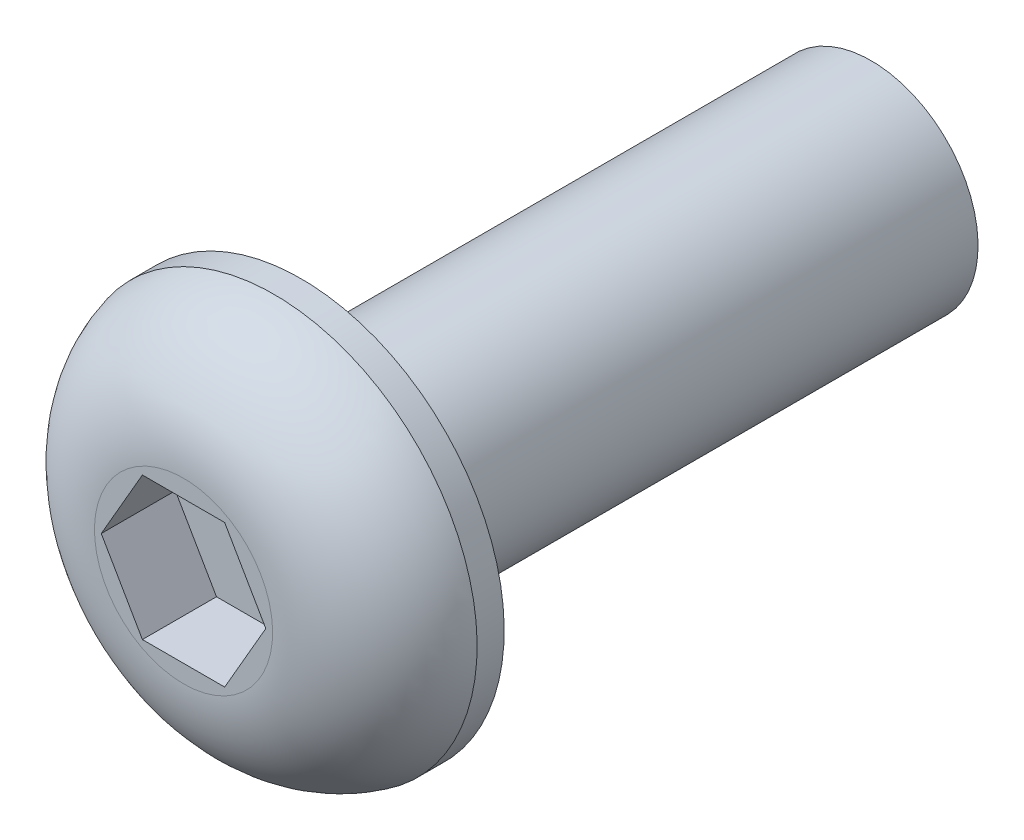
ISO-10303-21;
HEADER;
FILE_DESCRIPTION(('STEP AP214'),'2;1');
FILE_NAME('part.step','',(''),(''),'','','');
FILE_SCHEMA(('AUTOMOTIVE_DESIGN { 1 0 10303 214 1 1 1 1 }'));
ENDSEC;
DATA;
#1=APPLICATION_CONTEXT('core data for automotive mechanical design processes');
#2=APPLICATION_PROTOCOL_DEFINITION('international standard','automotive_design',2000,#1);
#3=PRODUCT_CONTEXT('',#1,'mechanical');
#4=PRODUCT('Part','Part','',(#3));
#5=PRODUCT_RELATED_PRODUCT_CATEGORY('part','',(#4));
#6=PRODUCT_DEFINITION_FORMATION('','',#4);
#7=PRODUCT_DEFINITION_CONTEXT('part definition',#1,'design');
#8=PRODUCT_DEFINITION('design','',#6,#7);
#9=PRODUCT_DEFINITION_SHAPE('','',#8);
#10=(LENGTH_UNIT() NAMED_UNIT(*) SI_UNIT(.MILLI.,.METRE.));
#11=(NAMED_UNIT(*) PLANE_ANGLE_UNIT() SI_UNIT($,.RADIAN.));
#12=(NAMED_UNIT(*) SI_UNIT($,.STERADIAN.) SOLID_ANGLE_UNIT());
#13=UNCERTAINTY_MEASURE_WITH_UNIT(LENGTH_MEASURE(1.E-05),#10,'distance_accuracy_value','');
#14=(GEOMETRIC_REPRESENTATION_CONTEXT(3) GLOBAL_UNCERTAINTY_ASSIGNED_CONTEXT((#13)) GLOBAL_UNIT_ASSIGNED_CONTEXT((#10,
#11,#12)) REPRESENTATION_CONTEXT('',''));
#15=CARTESIAN_POINT('',(0.,0.,0.));
#16=DIRECTION('',(0.,0.,1.));
#17=DIRECTION('',(1.,0.,0.));
#18=AXIS2_PLACEMENT_3D('',#15,#16,#17);
#19=CARTESIAN_POINT('',(0.,1.5,-8.));
#20=DIRECTION('',(0.,0.,1.));
#21=DIRECTION('',(0.,-1.,0.));
#22=AXIS2_PLACEMENT_3D('',#19,#20,#21);
#23=PLANE('',#22);
#24=CARTESIAN_POINT('',(0.,0.,-8.));
#25=DIRECTION('',(0.,0.,1.));
#26=DIRECTION('',(0.,-1.,0.));
#27=AXIS2_PLACEMENT_3D('',#24,#25,#26);
#28=CIRCLE('',#27,1.5);
#29=CARTESIAN_POINT('',(0.,-1.5,-8.));
#30=VERTEX_POINT('',#29);
#31=EDGE_CURVE('E11',#30,#30,#28,.T.);
#32=ORIENTED_EDGE('',*,*,#31,.F.);
#33=EDGE_LOOP('',(#32));
#34=FACE_BOUND('',#33,.T.);
#35=ADVANCED_FACE('F34',(#34),#23,.F.);
#36=CARTESIAN_POINT('',(0.,0.,5.58488227818494));
#37=DIRECTION('',(0.,0.,1.));
#38=DIRECTION('',(0.,-1.,0.));
#39=AXIS2_PLACEMENT_3D('',#36,#37,#38);
#40=CYLINDRICAL_SURFACE('',#39,1.5);
#41=CARTESIAN_POINT('',(0.,0.,0.));
#42=DIRECTION('',(0.,0.,1.));
#43=DIRECTION('',(0.,-1.,0.));
#44=AXIS2_PLACEMENT_3D('',#41,#42,#43);
#45=CIRCLE('',#44,1.5);
#46=CARTESIAN_POINT('',(0.,-1.5,0.));
#47=VERTEX_POINT('',#46);
#48=EDGE_CURVE('E41',#47,#47,#45,.T.);
#49=ORIENTED_EDGE('',*,*,#48,.F.);
#50=EDGE_LOOP('',(#49));
#51=FACE_BOUND('',#50,.T.);
#52=ORIENTED_EDGE('',*,*,#31,.T.);
#53=EDGE_LOOP('',(#52));
#54=FACE_BOUND('',#53,.T.);
#55=ADVANCED_FACE('F153',(#51,#54),#40,.T.);
#56=CARTESIAN_POINT('',(0.,2.85,0.));
#57=DIRECTION('',(0.,0.,1.));
#58=DIRECTION('',(0.,-1.,0.));
#59=AXIS2_PLACEMENT_3D('',#56,#57,#58);
#60=PLANE('',#59);
#61=CARTESIAN_POINT('',(0.,0.,0.));
#62=DIRECTION('',(0.,0.,1.));
#63=DIRECTION('',(0.,-1.,0.));
#64=AXIS2_PLACEMENT_3D('',#61,#62,#63);
#65=CIRCLE('',#64,2.85);
#66=CARTESIAN_POINT('',(0.,-2.85,0.));
#67=VERTEX_POINT('',#66);
#68=EDGE_CURVE('E146',#67,#67,#65,.T.);
#69=ORIENTED_EDGE('',*,*,#68,.F.);
#70=EDGE_LOOP('',(#69));
#71=FACE_BOUND('',#70,.T.);
#72=ORIENTED_EDGE('',*,*,#48,.T.);
#73=EDGE_LOOP('',(#72));
#74=FACE_BOUND('',#73,.T.);
#75=ADVANCED_FACE('F151',(#71,#74),#60,.F.);
#76=CARTESIAN_POINT('',(0.,0.,5.58488227818494));
#77=DIRECTION('',(0.,0.,1.));
#78=DIRECTION('',(0.,-1.,0.));
#79=AXIS2_PLACEMENT_3D('',#76,#77,#78);
#80=CYLINDRICAL_SURFACE('',#79,2.85);
#81=CARTESIAN_POINT('',(0.,0.,0.38));
#82=DIRECTION('',(0.,0.,1.));
#83=DIRECTION('',(0.,-1.,0.));
#84=AXIS2_PLACEMENT_3D('',#81,#82,#83);
#85=CIRCLE('',#84,2.85);
#86=CARTESIAN_POINT('',(0.,-2.85,0.38));
#87=VERTEX_POINT('',#86);
#88=EDGE_CURVE('E143',#87,#87,#85,.T.);
#89=ORIENTED_EDGE('',*,*,#88,.F.);
#90=EDGE_LOOP('',(#89));
#91=FACE_BOUND('',#90,.T.);
#92=ORIENTED_EDGE('',*,*,#68,.T.);
#93=EDGE_LOOP('',(#92));
#94=FACE_BOUND('',#93,.T.);
#95=ADVANCED_FACE('F171',(#91,#94),#80,.T.);
#96=CARTESIAN_POINT('',(0.,0.,0.00712598425196939));
#97=DIRECTION('',(0.,0.,1.));
#98=DIRECTION('',(0.,-1.,0.));
#99=AXIS2_PLACEMENT_3D('',#96,#97,#98);
#100=DEGENERATE_TOROIDAL_SURFACE('',#99,1.25,1.64287401574803,.T.);
#101=CARTESIAN_POINT('',(0.,0.,1.65));
#102=DIRECTION('',(0.,0.,1.));
#103=DIRECTION('',(0.,-1.,0.));
#104=AXIS2_PLACEMENT_3D('',#101,#102,#103);
#105=CIRCLE('',#104,1.25);
#106=CARTESIAN_POINT('',(0.,-1.25,1.65));
#107=VERTEX_POINT('',#106);
#108=EDGE_CURVE('E135',#107,#107,#105,.T.);
#109=ORIENTED_EDGE('',*,*,#108,.F.);
#110=EDGE_LOOP('',(#109));
#111=FACE_BOUND('',#110,.T.);
#112=ORIENTED_EDGE('',*,*,#88,.T.);
#113=EDGE_LOOP('',(#112));
#114=FACE_BOUND('',#113,.T.);
#115=ADVANCED_FACE('F179',(#111,#114),#100,.T.);
#116=CARTESIAN_POINT('',(0.,0.,1.65));
#117=DIRECTION('',(0.,0.,-1.));
#118=DIRECTION('',(0.,1.,0.));
#119=AXIS2_PLACEMENT_3D('',#116,#117,#118);
#120=PLANE('',#119);
#121=DIRECTION('',(0.5,0.866025403784439,0.));
#122=VECTOR('',#121,1.);
#123=CARTESIAN_POINT('',(0.577350269189626,-1.,1.65));
#124=LINE('',#123,#122);
#125=CARTESIAN_POINT('',(0.577350269189626,-1.,1.65));
#126=VERTEX_POINT('',#125);
#127=CARTESIAN_POINT('',(1.15470053837925,0.,1.65));
#128=VERTEX_POINT('',#127);
#129=EDGE_CURVE('E122',#126,#128,#124,.T.);
#130=ORIENTED_EDGE('',*,*,#129,.F.);
#131=DIRECTION('',(1.,0.,0.));
#132=VECTOR('',#131,1.);
#133=CARTESIAN_POINT('',(-0.577350269189626,-1.,1.65));
#134=LINE('',#133,#132);
#135=CARTESIAN_POINT('',(-0.577350269189626,-1.,1.65));
#136=VERTEX_POINT('',#135);
#137=EDGE_CURVE('E48',#136,#126,#134,.T.);
#138=ORIENTED_EDGE('',*,*,#137,.F.);
#139=DIRECTION('',(0.5,-0.866025403784439,0.));
#140=VECTOR('',#139,1.);
#141=CARTESIAN_POINT('',(-1.15470053837925,0.,1.65));
#142=LINE('',#141,#140);
#143=CARTESIAN_POINT('',(-1.15470053837925,0.,1.65));
#144=VERTEX_POINT('',#143);
#145=EDGE_CURVE('E131',#144,#136,#142,.T.);
#146=ORIENTED_EDGE('',*,*,#145,.F.);
#147=DIRECTION('',(-0.5,-0.866025403784439,0.));
#148=VECTOR('',#147,1.);
#149=CARTESIAN_POINT('',(-0.577350269189626,1.,1.65));
#150=LINE('',#149,#148);
#151=CARTESIAN_POINT('',(-0.577350269189626,1.,1.65));
#152=VERTEX_POINT('',#151);
#153=EDGE_CURVE('E129',#152,#144,#150,.T.);
#154=ORIENTED_EDGE('',*,*,#153,.F.);
#155=DIRECTION('',(-1.,0.,0.));
#156=VECTOR('',#155,1.);
#157=CARTESIAN_POINT('',(0.577350269189626,1.,1.65));
#158=LINE('',#157,#156);
#159=CARTESIAN_POINT('',(0.577350269189626,1.,1.65));
#160=VERTEX_POINT('',#159);
#161=EDGE_CURVE('E96',#160,#152,#158,.T.);
#162=ORIENTED_EDGE('',*,*,#161,.F.);
#163=DIRECTION('',(-0.5,0.866025403784439,0.));
#164=VECTOR('',#163,1.);
#165=CARTESIAN_POINT('',(1.15470053837925,0.,1.65));
#166=LINE('',#165,#164);
#167=EDGE_CURVE('E125',#128,#160,#166,.T.);
#168=ORIENTED_EDGE('',*,*,#167,.F.);
#169=EDGE_LOOP('',(#130,#138,#146,#154,#162,#168));
#170=FACE_BOUND('',#169,.T.);
#171=ORIENTED_EDGE('',*,*,#108,.T.);
#172=EDGE_LOOP('',(#171));
#173=FACE_BOUND('',#172,.T.);
#174=ADVANCED_FACE('F187',(#170,#173),#120,.F.);
#175=CARTESIAN_POINT('',(-0.577350269189626,-1.,0.61));
#176=DIRECTION('',(0.,-1.,0.));
#177=DIRECTION('',(1.,0.,0.));
#178=AXIS2_PLACEMENT_3D('',#175,#176,#177);
#179=PLANE('',#178);
#180=ORIENTED_EDGE('',*,*,#137,.T.);
#181=DIRECTION('',(0.,0.,1.));
#182=VECTOR('',#181,1.);
#183=CARTESIAN_POINT('',(0.577350269189626,-1.,0.61));
#184=LINE('',#183,#182);
#185=CARTESIAN_POINT('',(0.577350269189626,-1.,0.61));
#186=VERTEX_POINT('',#185);
#187=EDGE_CURVE('E78',#186,#126,#184,.T.);
#188=ORIENTED_EDGE('',*,*,#187,.F.);
#189=DIRECTION('',(1.,0.,0.));
#190=VECTOR('',#189,1.);
#191=CARTESIAN_POINT('',(-0.577350269189626,-1.,0.61));
#192=LINE('',#191,#190);
#193=CARTESIAN_POINT('',(-0.577350269189626,-1.,0.61));
#194=VERTEX_POINT('',#193);
#195=EDGE_CURVE('E133',#194,#186,#192,.T.);
#196=ORIENTED_EDGE('',*,*,#195,.F.);
#197=DIRECTION('',(0.,0.,1.));
#198=VECTOR('',#197,1.);
#199=CARTESIAN_POINT('',(-0.577350269189626,-1.,0.61));
#200=LINE('',#199,#198);
#201=EDGE_CURVE('E56',#194,#136,#200,.T.);
#202=ORIENTED_EDGE('',*,*,#201,.T.);
#203=EDGE_LOOP('',(#180,#188,#196,#202));
#204=FACE_BOUND('',#203,.T.);
#205=ADVANCED_FACE('F195',(#204),#179,.F.);
#206=CARTESIAN_POINT('',(-1.15470053837925,0.,0.61));
#207=DIRECTION('',(-0.866025403784439,-0.5,0.));
#208=DIRECTION('',(0.5,-0.866025403784439,0.));
#209=AXIS2_PLACEMENT_3D('',#206,#207,#208);
#210=PLANE('',#209);
#211=ORIENTED_EDGE('',*,*,#145,.T.);
#212=ORIENTED_EDGE('',*,*,#201,.F.);
#213=DIRECTION('',(0.5,-0.866025403784439,0.));
#214=VECTOR('',#213,1.);
#215=CARTESIAN_POINT('',(-1.15470053837925,0.,0.61));
#216=LINE('',#215,#214);
#217=CARTESIAN_POINT('',(-1.15470053837925,0.,0.61));
#218=VERTEX_POINT('',#217);
#219=EDGE_CURVE('E108',#218,#194,#216,.T.);
#220=ORIENTED_EDGE('',*,*,#219,.F.);
#221=DIRECTION('',(0.,0.,1.));
#222=VECTOR('',#221,1.);
#223=CARTESIAN_POINT('',(-1.15470053837925,0.,0.61));
#224=LINE('',#223,#222);
#225=EDGE_CURVE('E100',#218,#144,#224,.T.);
#226=ORIENTED_EDGE('',*,*,#225,.T.);
#227=EDGE_LOOP('',(#211,#212,#220,#226));
#228=FACE_BOUND('',#227,.T.);
#229=ADVANCED_FACE('F203',(#228),#210,.F.);
#230=CARTESIAN_POINT('',(-0.577350269189626,1.,0.61));
#231=DIRECTION('',(-0.866025403784439,0.5,0.));
#232=DIRECTION('',(-0.5,-0.866025403784439,0.));
#233=AXIS2_PLACEMENT_3D('',#230,#231,#232);
#234=PLANE('',#233);
#235=ORIENTED_EDGE('',*,*,#153,.T.);
#236=ORIENTED_EDGE('',*,*,#225,.F.);
#237=DIRECTION('',(-0.5,-0.866025403784439,0.));
#238=VECTOR('',#237,1.);
#239=CARTESIAN_POINT('',(-0.577350269189626,1.,0.61));
#240=LINE('',#239,#238);
#241=CARTESIAN_POINT('',(-0.577350269189626,1.,0.61));
#242=VERTEX_POINT('',#241);
#243=EDGE_CURVE('E104',#242,#218,#240,.T.);
#244=ORIENTED_EDGE('',*,*,#243,.F.);
#245=DIRECTION('',(0.,0.,1.));
#246=VECTOR('',#245,1.);
#247=CARTESIAN_POINT('',(-0.577350269189626,1.,0.61));
#248=LINE('',#247,#246);
#249=EDGE_CURVE('E89',#242,#152,#248,.T.);
#250=ORIENTED_EDGE('',*,*,#249,.T.);
#251=EDGE_LOOP('',(#235,#236,#244,#250));
#252=FACE_BOUND('',#251,.T.);
#253=ADVANCED_FACE('F105',(#252),#234,.F.);
#254=CARTESIAN_POINT('',(0.577350269189626,1.,0.61));
#255=DIRECTION('',(0.,1.,0.));
#256=DIRECTION('',(-1.,0.,0.));
#257=AXIS2_PLACEMENT_3D('',#254,#255,#256);
#258=PLANE('',#257);
#259=ORIENTED_EDGE('',*,*,#161,.T.);
#260=ORIENTED_EDGE('',*,*,#249,.F.);
#261=DIRECTION('',(-1.,0.,0.));
#262=VECTOR('',#261,1.);
#263=CARTESIAN_POINT('',(0.577350269189626,1.,0.61));
#264=LINE('',#263,#262);
#265=CARTESIAN_POINT('',(0.577350269189626,1.,0.61));
#266=VERTEX_POINT('',#265);
#267=EDGE_CURVE('E93',#266,#242,#264,.T.);
#268=ORIENTED_EDGE('',*,*,#267,.F.);
#269=DIRECTION('',(0.,0.,1.));
#270=VECTOR('',#269,1.);
#271=CARTESIAN_POINT('',(0.577350269189626,1.,0.61));
#272=LINE('',#271,#270);
#273=EDGE_CURVE('E101',#266,#160,#272,.T.);
#274=ORIENTED_EDGE('',*,*,#273,.T.);
#275=EDGE_LOOP('',(#259,#260,#268,#274));
#276=FACE_BOUND('',#275,.T.);
#277=ADVANCED_FACE('F91',(#276),#258,.F.);
#278=CARTESIAN_POINT('',(1.15470053837925,0.,0.61));
#279=DIRECTION('',(0.866025403784439,0.5,0.));
#280=DIRECTION('',(-0.5,0.866025403784439,0.));
#281=AXIS2_PLACEMENT_3D('',#278,#279,#280);
#282=PLANE('',#281);
#283=ORIENTED_EDGE('',*,*,#167,.T.);
#284=ORIENTED_EDGE('',*,*,#273,.F.);
#285=DIRECTION('',(-0.5,0.866025403784439,0.));
#286=VECTOR('',#285,1.);
#287=CARTESIAN_POINT('',(1.15470053837925,0.,0.61));
#288=LINE('',#287,#286);
#289=CARTESIAN_POINT('',(1.15470053837925,0.,0.61));
#290=VERTEX_POINT('',#289);
#291=EDGE_CURVE('E114',#290,#266,#288,.T.);
#292=ORIENTED_EDGE('',*,*,#291,.F.);
#293=DIRECTION('',(0.,0.,1.));
#294=VECTOR('',#293,1.);
#295=CARTESIAN_POINT('',(1.15470053837925,0.,0.61));
#296=LINE('',#295,#294);
#297=EDGE_CURVE('E138',#290,#128,#296,.T.);
#298=ORIENTED_EDGE('',*,*,#297,.T.);
#299=EDGE_LOOP('',(#283,#284,#292,#298));
#300=FACE_BOUND('',#299,.T.);
#301=ADVANCED_FACE('F222',(#300),#282,.F.);
#302=CARTESIAN_POINT('',(0.577350269189626,-1.,0.61));
#303=DIRECTION('',(0.866025403784439,-0.5,0.));
#304=DIRECTION('',(0.5,0.866025403784439,0.));
#305=AXIS2_PLACEMENT_3D('',#302,#303,#304);
#306=PLANE('',#305);
#307=ORIENTED_EDGE('',*,*,#129,.T.);
#308=ORIENTED_EDGE('',*,*,#297,.F.);
#309=DIRECTION('',(0.5,0.866025403784439,0.));
#310=VECTOR('',#309,1.);
#311=CARTESIAN_POINT('',(0.577350269189626,-1.,0.61));
#312=LINE('',#311,#310);
#313=EDGE_CURVE('E116',#186,#290,#312,.T.);
#314=ORIENTED_EDGE('',*,*,#313,.F.);
#315=ORIENTED_EDGE('',*,*,#187,.T.);
#316=EDGE_LOOP('',(#307,#308,#314,#315));
#317=FACE_BOUND('',#316,.T.);
#318=ADVANCED_FACE('F229',(#317),#306,.F.);
#319=CARTESIAN_POINT('',(-0.577350269189626,-1.,0.61));
#320=DIRECTION('',(0.,0.,-1.));
#321=DIRECTION('',(-1.,0.,0.));
#322=AXIS2_PLACEMENT_3D('',#319,#320,#321);
#323=PLANE('',#322);
#324=ORIENTED_EDGE('',*,*,#195,.T.);
#325=ORIENTED_EDGE('',*,*,#313,.T.);
#326=ORIENTED_EDGE('',*,*,#291,.T.);
#327=ORIENTED_EDGE('',*,*,#267,.T.);
#328=ORIENTED_EDGE('',*,*,#243,.T.);
#329=ORIENTED_EDGE('',*,*,#219,.T.);
#330=EDGE_LOOP('',(#324,#325,#326,#327,#328,#329));
#331=FACE_BOUND('',#330,.T.);
#332=ADVANCED_FACE('F111',(#331),#323,.F.);
#333=CLOSED_SHELL('',(#35,#55,#75,#95,#115,#174,#205,#229,#253,#277,#301,#318,#332));
#334=MANIFOLD_SOLID_BREP('B2',#333);
#335=ADVANCED_BREP_SHAPE_REPRESENTATION('',(#18,#334),#14);
#336=SHAPE_DEFINITION_REPRESENTATION(#9,#335);
ENDSEC;
END-ISO-10303-21;
